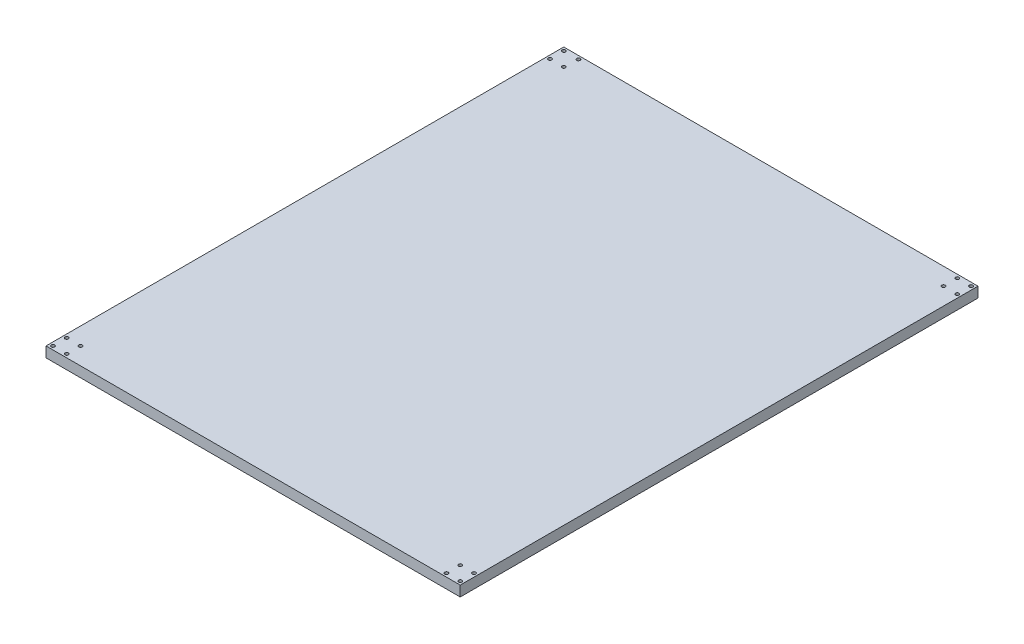
ISO-10303-21;
HEADER;
FILE_DESCRIPTION(('STEP AP214'),'2;1');
FILE_NAME('part.step','',(''),(''),'','','');
FILE_SCHEMA(('AUTOMOTIVE_DESIGN { 1 0 10303 214 1 1 1 1 }'));
ENDSEC;
DATA;
#1=APPLICATION_CONTEXT('core data for automotive mechanical design processes');
#2=APPLICATION_PROTOCOL_DEFINITION('international standard','automotive_design',2000,#1);
#3=PRODUCT_CONTEXT('',#1,'mechanical');
#4=PRODUCT('Part','Part','',(#3));
#5=PRODUCT_RELATED_PRODUCT_CATEGORY('part','',(#4));
#6=PRODUCT_DEFINITION_FORMATION('','',#4);
#7=PRODUCT_DEFINITION_CONTEXT('part definition',#1,'design');
#8=PRODUCT_DEFINITION('design','',#6,#7);
#9=PRODUCT_DEFINITION_SHAPE('','',#8);
#10=(LENGTH_UNIT() NAMED_UNIT(*) SI_UNIT(.MILLI.,.METRE.));
#11=(NAMED_UNIT(*) PLANE_ANGLE_UNIT() SI_UNIT($,.RADIAN.));
#12=(NAMED_UNIT(*) SI_UNIT($,.STERADIAN.) SOLID_ANGLE_UNIT());
#13=UNCERTAINTY_MEASURE_WITH_UNIT(LENGTH_MEASURE(1.E-05),#10,'distance_accuracy_value','');
#14=(GEOMETRIC_REPRESENTATION_CONTEXT(3) GLOBAL_UNCERTAINTY_ASSIGNED_CONTEXT((#13)) GLOBAL_UNIT_ASSIGNED_CONTEXT((#10,
#11,#12)) REPRESENTATION_CONTEXT('',''));
#15=CARTESIAN_POINT('',(0.,0.,0.));
#16=DIRECTION('',(0.,0.,1.));
#17=DIRECTION('',(1.,0.,0.));
#18=AXIS2_PLACEMENT_3D('',#15,#16,#17);
#19=CARTESIAN_POINT('',(-4129.0232543434,15.,-1607.60102005314));
#20=DIRECTION('',(0.,0.,1.));
#21=DIRECTION('',(1.,0.,0.));
#22=AXIS2_PLACEMENT_3D('',#19,#20,#21);
#23=PLANE('',#22);
#24=DIRECTION('',(-1.,0.,0.));
#25=VECTOR('',#24,1.);
#26=CARTESIAN_POINT('',(-4129.0232543434,0.,-1607.60102005314));
#27=LINE('',#26,#25);
#28=CARTESIAN_POINT('',(-4129.0232543434,0.,-1607.60102005314));
#29=VERTEX_POINT('',#28);
#30=CARTESIAN_POINT('',(-4729.0232543434,0.,-1607.60102005314));
#31=VERTEX_POINT('',#30);
#32=EDGE_CURVE('E105',#29,#31,#27,.T.);
#33=ORIENTED_EDGE('',*,*,#32,.F.);
#34=DIRECTION('',(0.,-1.,0.));
#35=VECTOR('',#34,1.);
#36=CARTESIAN_POINT('',(-4129.0232543434,15.,-1607.60102005314));
#37=LINE('',#36,#35);
#38=CARTESIAN_POINT('',(-4129.0232543434,15.,-1607.60102005314));
#39=VERTEX_POINT('',#38);
#40=EDGE_CURVE('E11',#39,#29,#37,.T.);
#41=ORIENTED_EDGE('',*,*,#40,.F.);
#42=DIRECTION('',(-1.,0.,0.));
#43=VECTOR('',#42,1.);
#44=CARTESIAN_POINT('',(-4129.0232543434,15.,-1607.60102005314));
#45=LINE('',#44,#43);
#46=CARTESIAN_POINT('',(-4729.0232543434,15.,-1607.60102005314));
#47=VERTEX_POINT('',#46);
#48=EDGE_CURVE('E99',#39,#47,#45,.T.);
#49=ORIENTED_EDGE('',*,*,#48,.T.);
#50=DIRECTION('',(0.,-1.,0.));
#51=VECTOR('',#50,1.);
#52=CARTESIAN_POINT('',(-4729.0232543434,15.,-1607.60102005314));
#53=LINE('',#52,#51);
#54=EDGE_CURVE('E78',#47,#31,#53,.T.);
#55=ORIENTED_EDGE('',*,*,#54,.T.);
#56=EDGE_LOOP('',(#33,#41,#49,#55));
#57=FACE_BOUND('',#56,.T.);
#58=ADVANCED_FACE('F37',(#57),#23,.T.);
#59=CARTESIAN_POINT('',(-4129.0232543434,15.,-1607.60102005314));
#60=DIRECTION('',(-1.,0.,0.));
#61=DIRECTION('',(0.,0.,1.));
#62=AXIS2_PLACEMENT_3D('',#59,#60,#61);
#63=PLANE('',#62);
#64=DIRECTION('',(0.,0.,-1.));
#65=VECTOR('',#64,1.);
#66=CARTESIAN_POINT('',(-4129.0232543434,0.,-1607.60102005314));
#67=LINE('',#66,#65);
#68=CARTESIAN_POINT('',(-4129.0232543434,0.,-2357.60102005314));
#69=VERTEX_POINT('',#68);
#70=EDGE_CURVE('E70',#29,#69,#67,.T.);
#71=ORIENTED_EDGE('',*,*,#70,.T.);
#72=DIRECTION('',(0.,-1.,0.));
#73=VECTOR('',#72,1.);
#74=CARTESIAN_POINT('',(-4129.0232543434,15.,-2357.60102005314));
#75=LINE('',#74,#73);
#76=CARTESIAN_POINT('',(-4129.0232543434,15.,-2357.60102005314));
#77=VERTEX_POINT('',#76);
#78=EDGE_CURVE('E46',#77,#69,#75,.T.);
#79=ORIENTED_EDGE('',*,*,#78,.F.);
#80=DIRECTION('',(0.,0.,-1.));
#81=VECTOR('',#80,1.);
#82=CARTESIAN_POINT('',(-4129.0232543434,15.,-1607.60102005314));
#83=LINE('',#82,#81);
#84=EDGE_CURVE('E88',#39,#77,#83,.T.);
#85=ORIENTED_EDGE('',*,*,#84,.F.);
#86=ORIENTED_EDGE('',*,*,#40,.T.);
#87=EDGE_LOOP('',(#71,#79,#85,#86));
#88=FACE_BOUND('',#87,.T.);
#89=ADVANCED_FACE('F143',(#88),#63,.F.);
#90=CARTESIAN_POINT('',(-4129.0232543434,15.,-2357.60102005314));
#91=DIRECTION('',(0.,0.,1.));
#92=DIRECTION('',(1.,0.,0.));
#93=AXIS2_PLACEMENT_3D('',#90,#91,#92);
#94=PLANE('',#93);
#95=DIRECTION('',(-1.,0.,0.));
#96=VECTOR('',#95,1.);
#97=CARTESIAN_POINT('',(-4129.0232543434,0.,-2357.60102005314));
#98=LINE('',#97,#96);
#99=CARTESIAN_POINT('',(-4729.0232543434,0.,-2357.60102005314));
#100=VERTEX_POINT('',#99);
#101=EDGE_CURVE('E95',#69,#100,#98,.T.);
#102=ORIENTED_EDGE('',*,*,#101,.T.);
#103=DIRECTION('',(0.,-1.,0.));
#104=VECTOR('',#103,1.);
#105=CARTESIAN_POINT('',(-4729.0232543434,15.,-2357.60102005314));
#106=LINE('',#105,#104);
#107=CARTESIAN_POINT('',(-4729.0232543434,15.,-2357.60102005314));
#108=VERTEX_POINT('',#107);
#109=EDGE_CURVE('E92',#108,#100,#106,.T.);
#110=ORIENTED_EDGE('',*,*,#109,.F.);
#111=DIRECTION('',(-1.,0.,0.));
#112=VECTOR('',#111,1.);
#113=CARTESIAN_POINT('',(-4129.0232543434,15.,-2357.60102005314));
#114=LINE('',#113,#112);
#115=EDGE_CURVE('E83',#77,#108,#114,.T.);
#116=ORIENTED_EDGE('',*,*,#115,.F.);
#117=ORIENTED_EDGE('',*,*,#78,.T.);
#118=EDGE_LOOP('',(#102,#110,#116,#117));
#119=FACE_BOUND('',#118,.T.);
#120=ADVANCED_FACE('F93',(#119),#94,.F.);
#121=CARTESIAN_POINT('',(-4729.0232543434,15.,-1607.60102005314));
#122=DIRECTION('',(-1.,0.,0.));
#123=DIRECTION('',(0.,0.,1.));
#124=AXIS2_PLACEMENT_3D('',#121,#122,#123);
#125=PLANE('',#124);
#126=DIRECTION('',(0.,0.,-1.));
#127=VECTOR('',#126,1.);
#128=CARTESIAN_POINT('',(-4729.0232543434,0.,-1607.60102005314));
#129=LINE('',#128,#127);
#130=EDGE_CURVE('E108',#31,#100,#129,.T.);
#131=ORIENTED_EDGE('',*,*,#130,.F.);
#132=ORIENTED_EDGE('',*,*,#54,.F.);
#133=DIRECTION('',(0.,0.,-1.));
#134=VECTOR('',#133,1.);
#135=CARTESIAN_POINT('',(-4729.0232543434,15.,-1607.60102005314));
#136=LINE('',#135,#134);
#137=EDGE_CURVE('E87',#47,#108,#136,.T.);
#138=ORIENTED_EDGE('',*,*,#137,.T.);
#139=ORIENTED_EDGE('',*,*,#109,.T.);
#140=EDGE_LOOP('',(#131,#132,#138,#139));
#141=FACE_BOUND('',#140,.T.);
#142=ADVANCED_FACE('F98',(#141),#125,.T.);
#143=CARTESIAN_POINT('',(0.,15.,0.));
#144=DIRECTION('',(0.,-1.,0.));
#145=DIRECTION('',(0.,0.,-1.));
#146=AXIS2_PLACEMENT_3D('',#143,#144,#145);
#147=PLANE('',#146);
#148=CARTESIAN_POINT('',(-4724.0232543434,15.,-2352.60102005314));
#149=DIRECTION('',(0.,1.,0.));
#150=DIRECTION('',(0.,0.,1.));
#151=AXIS2_PLACEMENT_3D('',#148,#149,#150);
#152=CIRCLE('',#151,2.50000000000039);
#153=CARTESIAN_POINT('',(-4724.0232543434,15.,-2350.10102005314));
#154=VERTEX_POINT('',#153);
#155=EDGE_CURVE('E231',#154,#154,#152,.T.);
#156=ORIENTED_EDGE('',*,*,#155,.F.);
#157=EDGE_LOOP('',(#156));
#158=FACE_BOUND('',#157,.T.);
#159=CARTESIAN_POINT('',(-4702.8096996987,15.,-2352.60102005314));
#160=DIRECTION('',(0.,1.,0.));
#161=DIRECTION('',(0.,0.,1.));
#162=AXIS2_PLACEMENT_3D('',#159,#160,#161);
#163=CIRCLE('',#162,2.50000000000039);
#164=CARTESIAN_POINT('',(-4702.8096996987,15.,-2350.10102005314));
#165=VERTEX_POINT('',#164);
#166=EDGE_CURVE('E233',#165,#165,#163,.T.);
#167=ORIENTED_EDGE('',*,*,#166,.F.);
#168=EDGE_LOOP('',(#167));
#169=FACE_BOUND('',#168,.T.);
#170=CARTESIAN_POINT('',(-4724.0232543434,15.,-2332.60102005314));
#171=DIRECTION('',(0.,1.,0.));
#172=DIRECTION('',(0.,0.,1.));
#173=AXIS2_PLACEMENT_3D('',#170,#171,#172);
#174=CIRCLE('',#173,2.50000000000039);
#175=CARTESIAN_POINT('',(-4724.0232543434,15.,-2330.10102005314));
#176=VERTEX_POINT('',#175);
#177=EDGE_CURVE('E241',#176,#176,#174,.T.);
#178=ORIENTED_EDGE('',*,*,#177,.F.);
#179=EDGE_LOOP('',(#178));
#180=FACE_BOUND('',#179,.T.);
#181=CARTESIAN_POINT('',(-4704.0232543434,15.,-2332.60102005314));
#182=DIRECTION('',(0.,1.,0.));
#183=DIRECTION('',(0.,0.,1.));
#184=AXIS2_PLACEMENT_3D('',#181,#182,#183);
#185=CIRCLE('',#184,2.50000000000039);
#186=CARTESIAN_POINT('',(-4704.0232543434,15.,-2330.10102005314));
#187=VERTEX_POINT('',#186);
#188=EDGE_CURVE('E247',#187,#187,#185,.T.);
#189=ORIENTED_EDGE('',*,*,#188,.F.);
#190=EDGE_LOOP('',(#189));
#191=FACE_BOUND('',#190,.T.);
#192=CARTESIAN_POINT('',(-4134.0232543434,15.,-2352.60102005314));
#193=DIRECTION('',(0.,1.,0.));
#194=DIRECTION('',(0.,0.,1.));
#195=AXIS2_PLACEMENT_3D('',#192,#193,#194);
#196=CIRCLE('',#195,2.50000000000039);
#197=CARTESIAN_POINT('',(-4134.0232543434,15.,-2350.10102005314));
#198=VERTEX_POINT('',#197);
#199=EDGE_CURVE('E253',#198,#198,#196,.T.);
#200=ORIENTED_EDGE('',*,*,#199,.F.);
#201=EDGE_LOOP('',(#200));
#202=FACE_BOUND('',#201,.T.);
#203=CARTESIAN_POINT('',(-4154.0232543434,15.,-2352.60102005314));
#204=DIRECTION('',(0.,1.,0.));
#205=DIRECTION('',(0.,0.,1.));
#206=AXIS2_PLACEMENT_3D('',#203,#204,#205);
#207=CIRCLE('',#206,2.50000000000039);
#208=CARTESIAN_POINT('',(-4154.0232543434,15.,-2350.10102005314));
#209=VERTEX_POINT('',#208);
#210=EDGE_CURVE('E259',#209,#209,#207,.T.);
#211=ORIENTED_EDGE('',*,*,#210,.F.);
#212=EDGE_LOOP('',(#211));
#213=FACE_BOUND('',#212,.T.);
#214=CARTESIAN_POINT('',(-4154.0232543434,15.,-2332.60102005314));
#215=DIRECTION('',(0.,1.,0.));
#216=DIRECTION('',(0.,0.,1.));
#217=AXIS2_PLACEMENT_3D('',#214,#215,#216);
#218=CIRCLE('',#217,2.50000000000039);
#219=CARTESIAN_POINT('',(-4154.0232543434,15.,-2330.10102005314));
#220=VERTEX_POINT('',#219);
#221=EDGE_CURVE('E265',#220,#220,#218,.T.);
#222=ORIENTED_EDGE('',*,*,#221,.F.);
#223=EDGE_LOOP('',(#222));
#224=FACE_BOUND('',#223,.T.);
#225=CARTESIAN_POINT('',(-4134.0232543434,15.,-2332.60102005314));
#226=DIRECTION('',(0.,1.,0.));
#227=DIRECTION('',(0.,0.,1.));
#228=AXIS2_PLACEMENT_3D('',#225,#226,#227);
#229=CIRCLE('',#228,2.50000000000039);
#230=CARTESIAN_POINT('',(-4134.0232543434,15.,-2330.10102005314));
#231=VERTEX_POINT('',#230);
#232=EDGE_CURVE('E271',#231,#231,#229,.T.);
#233=ORIENTED_EDGE('',*,*,#232,.F.);
#234=EDGE_LOOP('',(#233));
#235=FACE_BOUND('',#234,.T.);
#236=CARTESIAN_POINT('',(-4704.0232543434,15.,-1632.60102005314));
#237=DIRECTION('',(0.,1.,0.));
#238=DIRECTION('',(0.,0.,1.));
#239=AXIS2_PLACEMENT_3D('',#236,#237,#238);
#240=CIRCLE('',#239,2.50000000000039);
#241=CARTESIAN_POINT('',(-4704.0232543434,15.,-1630.10102005314));
#242=VERTEX_POINT('',#241);
#243=EDGE_CURVE('E277',#242,#242,#240,.T.);
#244=ORIENTED_EDGE('',*,*,#243,.F.);
#245=EDGE_LOOP('',(#244));
#246=FACE_BOUND('',#245,.T.);
#247=CARTESIAN_POINT('',(-4704.0232543434,15.,-1612.60102005314));
#248=DIRECTION('',(0.,1.,0.));
#249=DIRECTION('',(0.,0.,1.));
#250=AXIS2_PLACEMENT_3D('',#247,#248,#249);
#251=CIRCLE('',#250,2.50000000000039);
#252=CARTESIAN_POINT('',(-4704.0232543434,15.,-1610.10102005314));
#253=VERTEX_POINT('',#252);
#254=EDGE_CURVE('E283',#253,#253,#251,.T.);
#255=ORIENTED_EDGE('',*,*,#254,.F.);
#256=EDGE_LOOP('',(#255));
#257=FACE_BOUND('',#256,.T.);
#258=CARTESIAN_POINT('',(-4724.0232543434,15.,-1612.60102005314));
#259=DIRECTION('',(0.,1.,0.));
#260=DIRECTION('',(0.,0.,1.));
#261=AXIS2_PLACEMENT_3D('',#258,#259,#260);
#262=CIRCLE('',#261,2.50000000000039);
#263=CARTESIAN_POINT('',(-4724.0232543434,15.,-1610.10102005314));
#264=VERTEX_POINT('',#263);
#265=EDGE_CURVE('E289',#264,#264,#262,.T.);
#266=ORIENTED_EDGE('',*,*,#265,.F.);
#267=EDGE_LOOP('',(#266));
#268=FACE_BOUND('',#267,.T.);
#269=CARTESIAN_POINT('',(-4724.0232543434,15.,-1632.60102005314));
#270=DIRECTION('',(0.,1.,0.));
#271=DIRECTION('',(0.,0.,1.));
#272=AXIS2_PLACEMENT_3D('',#269,#270,#271);
#273=CIRCLE('',#272,2.50000000000039);
#274=CARTESIAN_POINT('',(-4724.0232543434,15.,-1630.10102005314));
#275=VERTEX_POINT('',#274);
#276=EDGE_CURVE('E295',#275,#275,#273,.T.);
#277=ORIENTED_EDGE('',*,*,#276,.F.);
#278=EDGE_LOOP('',(#277));
#279=FACE_BOUND('',#278,.T.);
#280=CARTESIAN_POINT('',(-4134.0232543434,15.,-1632.60102005314));
#281=DIRECTION('',(0.,1.,0.));
#282=DIRECTION('',(0.,0.,1.));
#283=AXIS2_PLACEMENT_3D('',#280,#281,#282);
#284=CIRCLE('',#283,2.50000000000039);
#285=CARTESIAN_POINT('',(-4134.0232543434,15.,-1630.10102005314));
#286=VERTEX_POINT('',#285);
#287=EDGE_CURVE('E301',#286,#286,#284,.T.);
#288=ORIENTED_EDGE('',*,*,#287,.F.);
#289=EDGE_LOOP('',(#288));
#290=FACE_BOUND('',#289,.T.);
#291=CARTESIAN_POINT('',(-4154.0232543434,15.,-1632.60102005314));
#292=DIRECTION('',(0.,1.,0.));
#293=DIRECTION('',(0.,0.,1.));
#294=AXIS2_PLACEMENT_3D('',#291,#292,#293);
#295=CIRCLE('',#294,2.50000000000039);
#296=CARTESIAN_POINT('',(-4154.0232543434,15.,-1630.10102005314));
#297=VERTEX_POINT('',#296);
#298=EDGE_CURVE('E128',#297,#297,#295,.T.);
#299=ORIENTED_EDGE('',*,*,#298,.F.);
#300=EDGE_LOOP('',(#299));
#301=FACE_BOUND('',#300,.T.);
#302=CARTESIAN_POINT('',(-4154.0232543434,15.,-1612.60102005314));
#303=DIRECTION('',(0.,1.,0.));
#304=DIRECTION('',(0.,0.,1.));
#305=AXIS2_PLACEMENT_3D('',#302,#303,#304);
#306=CIRCLE('',#305,2.50000000000039);
#307=CARTESIAN_POINT('',(-4154.0232543434,15.,-1610.10102005314));
#308=VERTEX_POINT('',#307);
#309=EDGE_CURVE('E117',#308,#308,#306,.T.);
#310=ORIENTED_EDGE('',*,*,#309,.F.);
#311=EDGE_LOOP('',(#310));
#312=FACE_BOUND('',#311,.T.);
#313=CARTESIAN_POINT('',(-4134.0232543434,15.,-1612.60102005314));
#314=DIRECTION('',(0.,1.,0.));
#315=DIRECTION('',(0.,0.,1.));
#316=AXIS2_PLACEMENT_3D('',#313,#314,#315);
#317=CIRCLE('',#316,2.50000000000039);
#318=CARTESIAN_POINT('',(-4134.0232543434,15.,-1610.10102005314));
#319=VERTEX_POINT('',#318);
#320=EDGE_CURVE('E116',#319,#319,#317,.T.);
#321=ORIENTED_EDGE('',*,*,#320,.F.);
#322=EDGE_LOOP('',(#321));
#323=FACE_BOUND('',#322,.T.);
#324=ORIENTED_EDGE('',*,*,#48,.F.);
#325=ORIENTED_EDGE('',*,*,#84,.T.);
#326=ORIENTED_EDGE('',*,*,#115,.T.);
#327=ORIENTED_EDGE('',*,*,#137,.F.);
#328=EDGE_LOOP('',(#324,#325,#326,#327));
#329=FACE_BOUND('',#328,.T.);
#330=ADVANCED_FACE('F86',(#158,#169,#180,#191,#202,#213,#224,#235,#246,#257,#268,#279,#290,#301,
#312,#323,#329),#147,.F.);
#331=CARTESIAN_POINT('',(0.,0.,0.));
#332=DIRECTION('',(0.,-1.,0.));
#333=DIRECTION('',(0.,0.,-1.));
#334=AXIS2_PLACEMENT_3D('',#331,#332,#333);
#335=PLANE('',#334);
#336=CARTESIAN_POINT('',(-4724.0232543434,0.,-2352.60102005314));
#337=DIRECTION('',(0.,1.,0.));
#338=DIRECTION('',(0.,0.,1.));
#339=AXIS2_PLACEMENT_3D('',#336,#337,#338);
#340=CIRCLE('',#339,2.50000000000039);
#341=CARTESIAN_POINT('',(-4724.0232543434,0.,-2350.10102005314));
#342=VERTEX_POINT('',#341);
#343=EDGE_CURVE('E229',#342,#342,#340,.T.);
#344=ORIENTED_EDGE('',*,*,#343,.T.);
#345=EDGE_LOOP('',(#344));
#346=FACE_BOUND('',#345,.T.);
#347=CARTESIAN_POINT('',(-4702.8096996987,0.,-2352.60102005314));
#348=DIRECTION('',(0.,1.,0.));
#349=DIRECTION('',(0.,0.,1.));
#350=AXIS2_PLACEMENT_3D('',#347,#348,#349);
#351=CIRCLE('',#350,2.50000000000039);
#352=CARTESIAN_POINT('',(-4702.8096996987,0.,-2350.10102005314));
#353=VERTEX_POINT('',#352);
#354=EDGE_CURVE('E238',#353,#353,#351,.T.);
#355=ORIENTED_EDGE('',*,*,#354,.T.);
#356=EDGE_LOOP('',(#355));
#357=FACE_BOUND('',#356,.T.);
#358=CARTESIAN_POINT('',(-4724.0232543434,0.,-2332.60102005314));
#359=DIRECTION('',(0.,1.,0.));
#360=DIRECTION('',(0.,0.,1.));
#361=AXIS2_PLACEMENT_3D('',#358,#359,#360);
#362=CIRCLE('',#361,2.50000000000039);
#363=CARTESIAN_POINT('',(-4724.0232543434,0.,-2330.10102005314));
#364=VERTEX_POINT('',#363);
#365=EDGE_CURVE('E244',#364,#364,#362,.T.);
#366=ORIENTED_EDGE('',*,*,#365,.T.);
#367=EDGE_LOOP('',(#366));
#368=FACE_BOUND('',#367,.T.);
#369=CARTESIAN_POINT('',(-4704.0232543434,0.,-2332.60102005314));
#370=DIRECTION('',(0.,1.,0.));
#371=DIRECTION('',(0.,0.,1.));
#372=AXIS2_PLACEMENT_3D('',#369,#370,#371);
#373=CIRCLE('',#372,2.50000000000039);
#374=CARTESIAN_POINT('',(-4704.0232543434,0.,-2330.10102005314));
#375=VERTEX_POINT('',#374);
#376=EDGE_CURVE('E250',#375,#375,#373,.T.);
#377=ORIENTED_EDGE('',*,*,#376,.T.);
#378=EDGE_LOOP('',(#377));
#379=FACE_BOUND('',#378,.T.);
#380=CARTESIAN_POINT('',(-4134.0232543434,0.,-2352.60102005314));
#381=DIRECTION('',(0.,1.,0.));
#382=DIRECTION('',(0.,0.,1.));
#383=AXIS2_PLACEMENT_3D('',#380,#381,#382);
#384=CIRCLE('',#383,2.50000000000039);
#385=CARTESIAN_POINT('',(-4134.0232543434,0.,-2350.10102005314));
#386=VERTEX_POINT('',#385);
#387=EDGE_CURVE('E256',#386,#386,#384,.T.);
#388=ORIENTED_EDGE('',*,*,#387,.T.);
#389=EDGE_LOOP('',(#388));
#390=FACE_BOUND('',#389,.T.);
#391=CARTESIAN_POINT('',(-4154.0232543434,0.,-2352.60102005314));
#392=DIRECTION('',(0.,1.,0.));
#393=DIRECTION('',(0.,0.,1.));
#394=AXIS2_PLACEMENT_3D('',#391,#392,#393);
#395=CIRCLE('',#394,2.50000000000039);
#396=CARTESIAN_POINT('',(-4154.0232543434,0.,-2350.10102005314));
#397=VERTEX_POINT('',#396);
#398=EDGE_CURVE('E262',#397,#397,#395,.T.);
#399=ORIENTED_EDGE('',*,*,#398,.T.);
#400=EDGE_LOOP('',(#399));
#401=FACE_BOUND('',#400,.T.);
#402=CARTESIAN_POINT('',(-4154.0232543434,0.,-2332.60102005314));
#403=DIRECTION('',(0.,1.,0.));
#404=DIRECTION('',(0.,0.,1.));
#405=AXIS2_PLACEMENT_3D('',#402,#403,#404);
#406=CIRCLE('',#405,2.50000000000039);
#407=CARTESIAN_POINT('',(-4154.0232543434,0.,-2330.10102005314));
#408=VERTEX_POINT('',#407);
#409=EDGE_CURVE('E268',#408,#408,#406,.T.);
#410=ORIENTED_EDGE('',*,*,#409,.T.);
#411=EDGE_LOOP('',(#410));
#412=FACE_BOUND('',#411,.T.);
#413=CARTESIAN_POINT('',(-4134.0232543434,0.,-2332.60102005314));
#414=DIRECTION('',(0.,1.,0.));
#415=DIRECTION('',(0.,0.,1.));
#416=AXIS2_PLACEMENT_3D('',#413,#414,#415);
#417=CIRCLE('',#416,2.50000000000039);
#418=CARTESIAN_POINT('',(-4134.0232543434,0.,-2330.10102005314));
#419=VERTEX_POINT('',#418);
#420=EDGE_CURVE('E274',#419,#419,#417,.T.);
#421=ORIENTED_EDGE('',*,*,#420,.T.);
#422=EDGE_LOOP('',(#421));
#423=FACE_BOUND('',#422,.T.);
#424=CARTESIAN_POINT('',(-4704.0232543434,0.,-1632.60102005314));
#425=DIRECTION('',(0.,1.,0.));
#426=DIRECTION('',(0.,0.,1.));
#427=AXIS2_PLACEMENT_3D('',#424,#425,#426);
#428=CIRCLE('',#427,2.50000000000039);
#429=CARTESIAN_POINT('',(-4704.0232543434,0.,-1630.10102005314));
#430=VERTEX_POINT('',#429);
#431=EDGE_CURVE('E280',#430,#430,#428,.T.);
#432=ORIENTED_EDGE('',*,*,#431,.T.);
#433=EDGE_LOOP('',(#432));
#434=FACE_BOUND('',#433,.T.);
#435=CARTESIAN_POINT('',(-4704.0232543434,0.,-1612.60102005314));
#436=DIRECTION('',(0.,1.,0.));
#437=DIRECTION('',(0.,0.,1.));
#438=AXIS2_PLACEMENT_3D('',#435,#436,#437);
#439=CIRCLE('',#438,2.50000000000039);
#440=CARTESIAN_POINT('',(-4704.0232543434,0.,-1610.10102005314));
#441=VERTEX_POINT('',#440);
#442=EDGE_CURVE('E286',#441,#441,#439,.T.);
#443=ORIENTED_EDGE('',*,*,#442,.T.);
#444=EDGE_LOOP('',(#443));
#445=FACE_BOUND('',#444,.T.);
#446=CARTESIAN_POINT('',(-4724.0232543434,0.,-1612.60102005314));
#447=DIRECTION('',(0.,1.,0.));
#448=DIRECTION('',(0.,0.,1.));
#449=AXIS2_PLACEMENT_3D('',#446,#447,#448);
#450=CIRCLE('',#449,2.50000000000039);
#451=CARTESIAN_POINT('',(-4724.0232543434,0.,-1610.10102005314));
#452=VERTEX_POINT('',#451);
#453=EDGE_CURVE('E292',#452,#452,#450,.T.);
#454=ORIENTED_EDGE('',*,*,#453,.T.);
#455=EDGE_LOOP('',(#454));
#456=FACE_BOUND('',#455,.T.);
#457=CARTESIAN_POINT('',(-4724.0232543434,0.,-1632.60102005314));
#458=DIRECTION('',(0.,1.,0.));
#459=DIRECTION('',(0.,0.,1.));
#460=AXIS2_PLACEMENT_3D('',#457,#458,#459);
#461=CIRCLE('',#460,2.50000000000039);
#462=CARTESIAN_POINT('',(-4724.0232543434,0.,-1630.10102005314));
#463=VERTEX_POINT('',#462);
#464=EDGE_CURVE('E298',#463,#463,#461,.T.);
#465=ORIENTED_EDGE('',*,*,#464,.T.);
#466=EDGE_LOOP('',(#465));
#467=FACE_BOUND('',#466,.T.);
#468=CARTESIAN_POINT('',(-4134.0232543434,0.,-1632.60102005314));
#469=DIRECTION('',(0.,-1.,0.));
#470=DIRECTION('',(0.,0.,-1.));
#471=AXIS2_PLACEMENT_3D('',#468,#469,#470);
#472=CIRCLE('',#471,2.50000000000039);
#473=CARTESIAN_POINT('',(-4134.0232543434,0.,-1635.10102005314));
#474=VERTEX_POINT('',#473);
#475=EDGE_CURVE('E40',#474,#474,#472,.T.);
#476=ORIENTED_EDGE('',*,*,#475,.F.);
#477=EDGE_LOOP('',(#476));
#478=FACE_BOUND('',#477,.T.);
#479=CARTESIAN_POINT('',(-4154.0232543434,0.,-1632.60102005314));
#480=DIRECTION('',(0.,-1.,0.));
#481=DIRECTION('',(0.,0.,-1.));
#482=AXIS2_PLACEMENT_3D('',#479,#480,#481);
#483=CIRCLE('',#482,2.50000000000039);
#484=CARTESIAN_POINT('',(-4154.0232543434,0.,-1635.10102005314));
#485=VERTEX_POINT('',#484);
#486=EDGE_CURVE('E123',#485,#485,#483,.T.);
#487=ORIENTED_EDGE('',*,*,#486,.F.);
#488=EDGE_LOOP('',(#487));
#489=FACE_BOUND('',#488,.T.);
#490=CARTESIAN_POINT('',(-4154.0232543434,0.,-1612.60102005314));
#491=DIRECTION('',(0.,-1.,0.));
#492=DIRECTION('',(0.,0.,-1.));
#493=AXIS2_PLACEMENT_3D('',#490,#491,#492);
#494=CIRCLE('',#493,2.50000000000039);
#495=CARTESIAN_POINT('',(-4154.0232543434,0.,-1615.10102005314));
#496=VERTEX_POINT('',#495);
#497=EDGE_CURVE('E114',#496,#496,#494,.T.);
#498=ORIENTED_EDGE('',*,*,#497,.F.);
#499=EDGE_LOOP('',(#498));
#500=FACE_BOUND('',#499,.T.);
#501=CARTESIAN_POINT('',(-4134.0232543434,0.,-1612.60102005314));
#502=DIRECTION('',(0.,-1.,0.));
#503=DIRECTION('',(0.,0.,-1.));
#504=AXIS2_PLACEMENT_3D('',#501,#502,#503);
#505=CIRCLE('',#504,2.50000000000039);
#506=CARTESIAN_POINT('',(-4134.0232543434,0.,-1615.10102005314));
#507=VERTEX_POINT('',#506);
#508=EDGE_CURVE('E109',#507,#507,#505,.T.);
#509=ORIENTED_EDGE('',*,*,#508,.F.);
#510=EDGE_LOOP('',(#509));
#511=FACE_BOUND('',#510,.T.);
#512=ORIENTED_EDGE('',*,*,#32,.T.);
#513=ORIENTED_EDGE('',*,*,#130,.T.);
#514=ORIENTED_EDGE('',*,*,#101,.F.);
#515=ORIENTED_EDGE('',*,*,#70,.F.);
#516=EDGE_LOOP('',(#512,#513,#514,#515));
#517=FACE_BOUND('',#516,.T.);
#518=ADVANCED_FACE('F137',(#346,#357,#368,#379,#390,#401,#412,#423,#434,#445,#456,#467,#478,
#489,#500,#511,#517),#335,.T.);
#519=CARTESIAN_POINT('',(-4134.0232543434,15.,-1612.60102005314));
#520=DIRECTION('',(0.,1.,0.));
#521=DIRECTION('',(0.,0.,1.));
#522=AXIS2_PLACEMENT_3D('',#519,#520,#521);
#523=CYLINDRICAL_SURFACE('',#522,2.50000000000039);
#524=ORIENTED_EDGE('',*,*,#508,.T.);
#525=EDGE_LOOP('',(#524));
#526=FACE_BOUND('',#525,.T.);
#527=ORIENTED_EDGE('',*,*,#320,.T.);
#528=EDGE_LOOP('',(#527));
#529=FACE_BOUND('',#528,.T.);
#530=ADVANCED_FACE('F134',(#526,#529),#523,.F.);
#531=CARTESIAN_POINT('',(-4154.0232543434,15.,-1612.60102005314));
#532=DIRECTION('',(0.,1.,0.));
#533=DIRECTION('',(0.,0.,1.));
#534=AXIS2_PLACEMENT_3D('',#531,#532,#533);
#535=CYLINDRICAL_SURFACE('',#534,2.50000000000039);
#536=ORIENTED_EDGE('',*,*,#497,.T.);
#537=EDGE_LOOP('',(#536));
#538=FACE_BOUND('',#537,.T.);
#539=ORIENTED_EDGE('',*,*,#309,.T.);
#540=EDGE_LOOP('',(#539));
#541=FACE_BOUND('',#540,.T.);
#542=ADVANCED_FACE('F166',(#538,#541),#535,.F.);
#543=CARTESIAN_POINT('',(-4154.0232543434,15.,-1632.60102005314));
#544=DIRECTION('',(0.,1.,0.));
#545=DIRECTION('',(0.,0.,1.));
#546=AXIS2_PLACEMENT_3D('',#543,#544,#545);
#547=CYLINDRICAL_SURFACE('',#546,2.50000000000039);
#548=ORIENTED_EDGE('',*,*,#486,.T.);
#549=EDGE_LOOP('',(#548));
#550=FACE_BOUND('',#549,.T.);
#551=ORIENTED_EDGE('',*,*,#298,.T.);
#552=EDGE_LOOP('',(#551));
#553=FACE_BOUND('',#552,.T.);
#554=ADVANCED_FACE('F169',(#550,#553),#547,.F.);
#555=CARTESIAN_POINT('',(-4134.0232543434,15.,-1632.60102005314));
#556=DIRECTION('',(0.,1.,0.));
#557=DIRECTION('',(0.,0.,1.));
#558=AXIS2_PLACEMENT_3D('',#555,#556,#557);
#559=CYLINDRICAL_SURFACE('',#558,2.50000000000039);
#560=ORIENTED_EDGE('',*,*,#475,.T.);
#561=EDGE_LOOP('',(#560));
#562=FACE_BOUND('',#561,.T.);
#563=ORIENTED_EDGE('',*,*,#287,.T.);
#564=EDGE_LOOP('',(#563));
#565=FACE_BOUND('',#564,.T.);
#566=ADVANCED_FACE('F172',(#562,#565),#559,.F.);
#567=CARTESIAN_POINT('',(-4724.0232543434,15.,-1632.60102005314));
#568=DIRECTION('',(0.,1.,0.));
#569=DIRECTION('',(0.,0.,1.));
#570=AXIS2_PLACEMENT_3D('',#567,#568,#569);
#571=CYLINDRICAL_SURFACE('',#570,2.50000000000039);
#572=ORIENTED_EDGE('',*,*,#464,.F.);
#573=EDGE_LOOP('',(#572));
#574=FACE_BOUND('',#573,.T.);
#575=ORIENTED_EDGE('',*,*,#276,.T.);
#576=EDGE_LOOP('',(#575));
#577=FACE_BOUND('',#576,.T.);
#578=ADVANCED_FACE('F176',(#574,#577),#571,.F.);
#579=CARTESIAN_POINT('',(-4724.0232543434,15.,-1612.60102005314));
#580=DIRECTION('',(0.,1.,0.));
#581=DIRECTION('',(0.,0.,1.));
#582=AXIS2_PLACEMENT_3D('',#579,#580,#581);
#583=CYLINDRICAL_SURFACE('',#582,2.50000000000039);
#584=ORIENTED_EDGE('',*,*,#453,.F.);
#585=EDGE_LOOP('',(#584));
#586=FACE_BOUND('',#585,.T.);
#587=ORIENTED_EDGE('',*,*,#265,.T.);
#588=EDGE_LOOP('',(#587));
#589=FACE_BOUND('',#588,.T.);
#590=ADVANCED_FACE('F180',(#586,#589),#583,.F.);
#591=CARTESIAN_POINT('',(-4704.0232543434,15.,-1612.60102005314));
#592=DIRECTION('',(0.,1.,0.));
#593=DIRECTION('',(0.,0.,1.));
#594=AXIS2_PLACEMENT_3D('',#591,#592,#593);
#595=CYLINDRICAL_SURFACE('',#594,2.50000000000039);
#596=ORIENTED_EDGE('',*,*,#442,.F.);
#597=EDGE_LOOP('',(#596));
#598=FACE_BOUND('',#597,.T.);
#599=ORIENTED_EDGE('',*,*,#254,.T.);
#600=EDGE_LOOP('',(#599));
#601=FACE_BOUND('',#600,.T.);
#602=ADVANCED_FACE('F184',(#598,#601),#595,.F.);
#603=CARTESIAN_POINT('',(-4704.0232543434,15.,-1632.60102005314));
#604=DIRECTION('',(0.,1.,0.));
#605=DIRECTION('',(0.,0.,1.));
#606=AXIS2_PLACEMENT_3D('',#603,#604,#605);
#607=CYLINDRICAL_SURFACE('',#606,2.50000000000039);
#608=ORIENTED_EDGE('',*,*,#431,.F.);
#609=EDGE_LOOP('',(#608));
#610=FACE_BOUND('',#609,.T.);
#611=ORIENTED_EDGE('',*,*,#243,.T.);
#612=EDGE_LOOP('',(#611));
#613=FACE_BOUND('',#612,.T.);
#614=ADVANCED_FACE('F188',(#610,#613),#607,.F.);
#615=CARTESIAN_POINT('',(-4134.0232543434,15.,-2332.60102005314));
#616=DIRECTION('',(0.,1.,0.));
#617=DIRECTION('',(0.,0.,1.));
#618=AXIS2_PLACEMENT_3D('',#615,#616,#617);
#619=CYLINDRICAL_SURFACE('',#618,2.50000000000039);
#620=ORIENTED_EDGE('',*,*,#420,.F.);
#621=EDGE_LOOP('',(#620));
#622=FACE_BOUND('',#621,.T.);
#623=ORIENTED_EDGE('',*,*,#232,.T.);
#624=EDGE_LOOP('',(#623));
#625=FACE_BOUND('',#624,.T.);
#626=ADVANCED_FACE('F192',(#622,#625),#619,.F.);
#627=CARTESIAN_POINT('',(-4154.0232543434,15.,-2332.60102005314));
#628=DIRECTION('',(0.,1.,0.));
#629=DIRECTION('',(0.,0.,1.));
#630=AXIS2_PLACEMENT_3D('',#627,#628,#629);
#631=CYLINDRICAL_SURFACE('',#630,2.50000000000039);
#632=ORIENTED_EDGE('',*,*,#409,.F.);
#633=EDGE_LOOP('',(#632));
#634=FACE_BOUND('',#633,.T.);
#635=ORIENTED_EDGE('',*,*,#221,.T.);
#636=EDGE_LOOP('',(#635));
#637=FACE_BOUND('',#636,.T.);
#638=ADVANCED_FACE('F196',(#634,#637),#631,.F.);
#639=CARTESIAN_POINT('',(-4154.0232543434,15.,-2352.60102005314));
#640=DIRECTION('',(0.,1.,0.));
#641=DIRECTION('',(0.,0.,1.));
#642=AXIS2_PLACEMENT_3D('',#639,#640,#641);
#643=CYLINDRICAL_SURFACE('',#642,2.50000000000039);
#644=ORIENTED_EDGE('',*,*,#398,.F.);
#645=EDGE_LOOP('',(#644));
#646=FACE_BOUND('',#645,.T.);
#647=ORIENTED_EDGE('',*,*,#210,.T.);
#648=EDGE_LOOP('',(#647));
#649=FACE_BOUND('',#648,.T.);
#650=ADVANCED_FACE('F200',(#646,#649),#643,.F.);
#651=CARTESIAN_POINT('',(-4134.0232543434,15.,-2352.60102005314));
#652=DIRECTION('',(0.,1.,0.));
#653=DIRECTION('',(0.,0.,1.));
#654=AXIS2_PLACEMENT_3D('',#651,#652,#653);
#655=CYLINDRICAL_SURFACE('',#654,2.50000000000039);
#656=ORIENTED_EDGE('',*,*,#387,.F.);
#657=EDGE_LOOP('',(#656));
#658=FACE_BOUND('',#657,.T.);
#659=ORIENTED_EDGE('',*,*,#199,.T.);
#660=EDGE_LOOP('',(#659));
#661=FACE_BOUND('',#660,.T.);
#662=ADVANCED_FACE('F204',(#658,#661),#655,.F.);
#663=CARTESIAN_POINT('',(-4704.0232543434,15.,-2332.60102005314));
#664=DIRECTION('',(0.,1.,0.));
#665=DIRECTION('',(0.,0.,1.));
#666=AXIS2_PLACEMENT_3D('',#663,#664,#665);
#667=CYLINDRICAL_SURFACE('',#666,2.50000000000039);
#668=ORIENTED_EDGE('',*,*,#376,.F.);
#669=EDGE_LOOP('',(#668));
#670=FACE_BOUND('',#669,.T.);
#671=ORIENTED_EDGE('',*,*,#188,.T.);
#672=EDGE_LOOP('',(#671));
#673=FACE_BOUND('',#672,.T.);
#674=ADVANCED_FACE('F208',(#670,#673),#667,.F.);
#675=CARTESIAN_POINT('',(-4724.0232543434,15.,-2332.60102005314));
#676=DIRECTION('',(0.,1.,0.));
#677=DIRECTION('',(0.,0.,1.));
#678=AXIS2_PLACEMENT_3D('',#675,#676,#677);
#679=CYLINDRICAL_SURFACE('',#678,2.50000000000039);
#680=ORIENTED_EDGE('',*,*,#365,.F.);
#681=EDGE_LOOP('',(#680));
#682=FACE_BOUND('',#681,.T.);
#683=ORIENTED_EDGE('',*,*,#177,.T.);
#684=EDGE_LOOP('',(#683));
#685=FACE_BOUND('',#684,.T.);
#686=ADVANCED_FACE('F212',(#682,#685),#679,.F.);
#687=CARTESIAN_POINT('',(-4702.8096996987,15.,-2352.60102005314));
#688=DIRECTION('',(0.,1.,0.));
#689=DIRECTION('',(0.,0.,1.));
#690=AXIS2_PLACEMENT_3D('',#687,#688,#689);
#691=CYLINDRICAL_SURFACE('',#690,2.50000000000039);
#692=ORIENTED_EDGE('',*,*,#354,.F.);
#693=EDGE_LOOP('',(#692));
#694=FACE_BOUND('',#693,.T.);
#695=ORIENTED_EDGE('',*,*,#166,.T.);
#696=EDGE_LOOP('',(#695));
#697=FACE_BOUND('',#696,.T.);
#698=ADVANCED_FACE('F216',(#694,#697),#691,.F.);
#699=CARTESIAN_POINT('',(-4724.0232543434,15.,-2352.60102005314));
#700=DIRECTION('',(0.,1.,0.));
#701=DIRECTION('',(0.,0.,1.));
#702=AXIS2_PLACEMENT_3D('',#699,#700,#701);
#703=CYLINDRICAL_SURFACE('',#702,2.50000000000039);
#704=ORIENTED_EDGE('',*,*,#343,.F.);
#705=EDGE_LOOP('',(#704));
#706=FACE_BOUND('',#705,.T.);
#707=ORIENTED_EDGE('',*,*,#155,.T.);
#708=EDGE_LOOP('',(#707));
#709=FACE_BOUND('',#708,.T.);
#710=ADVANCED_FACE('F220',(#706,#709),#703,.F.);
#711=CLOSED_SHELL('',(#58,#89,#120,#142,#330,#518,#530,#542,#554,#566,#578,#590,#602,#614,#626,
#638,#650,#662,#674,#686,#698,#710));
#712=MANIFOLD_SOLID_BREP('B2',#711);
#713=ADVANCED_BREP_SHAPE_REPRESENTATION('',(#18,#712),#14);
#714=SHAPE_DEFINITION_REPRESENTATION(#9,#713);
ENDSEC;
END-ISO-10303-21;
